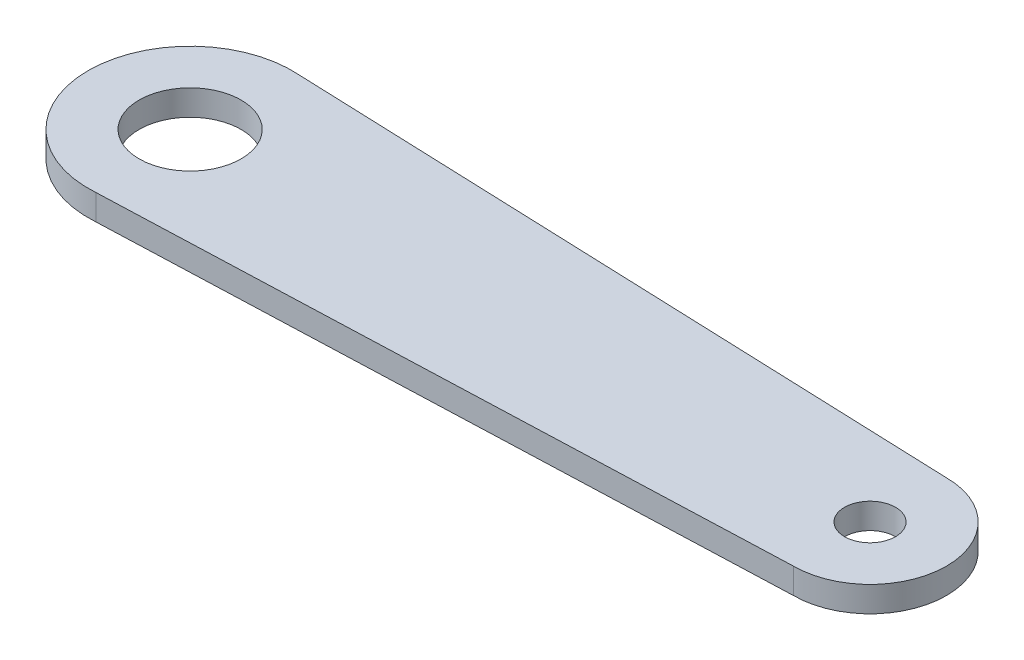
ISO-10303-21;
HEADER;
FILE_DESCRIPTION(('STEP AP214'),'2;1');
FILE_NAME('part.step','',(''),(''),'','','');
FILE_SCHEMA(('AUTOMOTIVE_DESIGN { 1 0 10303 214 1 1 1 1 }'));
ENDSEC;
DATA;
#1=APPLICATION_CONTEXT('core data for automotive mechanical design processes');
#2=APPLICATION_PROTOCOL_DEFINITION('international standard','automotive_design',2000,#1);
#3=PRODUCT_CONTEXT('',#1,'mechanical');
#4=PRODUCT('Part','Part','',(#3));
#5=PRODUCT_RELATED_PRODUCT_CATEGORY('part','',(#4));
#6=PRODUCT_DEFINITION_FORMATION('','',#4);
#7=PRODUCT_DEFINITION_CONTEXT('part definition',#1,'design');
#8=PRODUCT_DEFINITION('design','',#6,#7);
#9=PRODUCT_DEFINITION_SHAPE('','',#8);
#10=(LENGTH_UNIT() NAMED_UNIT(*) SI_UNIT(.MILLI.,.METRE.));
#11=(NAMED_UNIT(*) PLANE_ANGLE_UNIT() SI_UNIT($,.RADIAN.));
#12=(NAMED_UNIT(*) SI_UNIT($,.STERADIAN.) SOLID_ANGLE_UNIT());
#13=UNCERTAINTY_MEASURE_WITH_UNIT(LENGTH_MEASURE(1.E-05),#10,'distance_accuracy_value','');
#14=(GEOMETRIC_REPRESENTATION_CONTEXT(3) GLOBAL_UNCERTAINTY_ASSIGNED_CONTEXT((#13)) GLOBAL_UNIT_ASSIGNED_CONTEXT((#10,
#11,#12)) REPRESENTATION_CONTEXT('',''));
#15=CARTESIAN_POINT('',(0.,0.,0.));
#16=DIRECTION('',(0.,0.,1.));
#17=DIRECTION('',(1.,0.,0.));
#18=AXIS2_PLACEMENT_3D('',#15,#16,#17);
#19=CARTESIAN_POINT('',(0.,1.5,0.));
#20=DIRECTION('',(0.,-1.,0.));
#21=DIRECTION('',(0.,0.,-1.));
#22=AXIS2_PLACEMENT_3D('',#19,#20,#21);
#23=CYLINDRICAL_SURFACE('',#22,6.);
#24=CARTESIAN_POINT('',(0.,0.,0.));
#25=DIRECTION('',(0.,1.,0.));
#26=DIRECTION('',(0.,0.,1.));
#27=AXIS2_PLACEMENT_3D('',#24,#25,#26);
#28=CIRCLE('',#27,6.);
#29=CARTESIAN_POINT('',(0.449368076142934,0.,-5.98314869714464));
#30=VERTEX_POINT('',#29);
#31=CARTESIAN_POINT('',(0.449368076142934,0.,5.98314869714464));
#32=VERTEX_POINT('',#31);
#33=EDGE_CURVE('E102',#30,#32,#28,.T.);
#34=ORIENTED_EDGE('',*,*,#33,.T.);
#35=DIRECTION('',(0.,-1.,0.));
#36=VECTOR('',#35,1.);
#37=CARTESIAN_POINT('',(0.449368076142934,1.5,5.98314869714464));
#38=LINE('',#37,#36);
#39=CARTESIAN_POINT('',(0.449368076142934,1.5,5.98314869714464));
#40=VERTEX_POINT('',#39);
#41=EDGE_CURVE('E11',#40,#32,#38,.T.);
#42=ORIENTED_EDGE('',*,*,#41,.F.);
#43=CARTESIAN_POINT('',(0.,1.5,0.));
#44=DIRECTION('',(0.,1.,0.));
#45=DIRECTION('',(0.,0.,1.));
#46=AXIS2_PLACEMENT_3D('',#43,#44,#45);
#47=CIRCLE('',#46,6.);
#48=CARTESIAN_POINT('',(0.449368076142934,1.5,-5.98314869714464));
#49=VERTEX_POINT('',#48);
#50=EDGE_CURVE('E87',#49,#40,#47,.T.);
#51=ORIENTED_EDGE('',*,*,#50,.F.);
#52=DIRECTION('',(0.,-1.,0.));
#53=VECTOR('',#52,1.);
#54=CARTESIAN_POINT('',(0.449368076142934,1.5,-5.98314869714464));
#55=LINE('',#54,#53);
#56=EDGE_CURVE('E54',#49,#30,#55,.T.);
#57=ORIENTED_EDGE('',*,*,#56,.T.);
#58=EDGE_LOOP('',(#34,#42,#51,#57));
#59=FACE_BOUND('',#58,.T.);
#60=ADVANCED_FACE('F36',(#59),#23,.T.);
#61=CARTESIAN_POINT('',(0.449368076142934,1.5,5.98314869714464));
#62=DIRECTION('',(-0.0374736605890943,0.,-0.999297615709181));
#63=DIRECTION('',(-0.999297615709181,0.,0.0374736605890943));
#64=AXIS2_PLACEMENT_3D('',#61,#62,#63);
#65=PLANE('',#64);
#66=DIRECTION('',(0.999297615709181,0.,-0.0374736605890943));
#67=VECTOR('',#66,1.);
#68=CARTESIAN_POINT('',(0.449368076142934,0.,5.98314869714464));
#69=LINE('',#68,#67);
#70=CARTESIAN_POINT('',(40.,0.,4.5));
#71=VERTEX_POINT('',#70);
#72=EDGE_CURVE('E92',#32,#71,#69,.T.);
#73=ORIENTED_EDGE('',*,*,#72,.T.);
#74=DIRECTION('',(0.,-1.,0.));
#75=VECTOR('',#74,1.);
#76=CARTESIAN_POINT('',(40.,1.5,4.5));
#77=LINE('',#76,#75);
#78=CARTESIAN_POINT('',(40.,1.5,4.5));
#79=VERTEX_POINT('',#78);
#80=EDGE_CURVE('E45',#79,#71,#77,.T.);
#81=ORIENTED_EDGE('',*,*,#80,.F.);
#82=DIRECTION('',(0.999297615709181,0.,-0.0374736605890943));
#83=VECTOR('',#82,1.);
#84=CARTESIAN_POINT('',(0.449368076142934,1.5,5.98314869714464));
#85=LINE('',#84,#83);
#86=EDGE_CURVE('E80',#40,#79,#85,.T.);
#87=ORIENTED_EDGE('',*,*,#86,.F.);
#88=ORIENTED_EDGE('',*,*,#41,.T.);
#89=EDGE_LOOP('',(#73,#81,#87,#88));
#90=FACE_BOUND('',#89,.T.);
#91=ADVANCED_FACE('F91',(#90),#65,.F.);
#92=CARTESIAN_POINT('',(40.,1.5,0.));
#93=DIRECTION('',(0.,-1.,0.));
#94=DIRECTION('',(0.,0.,-1.));
#95=AXIS2_PLACEMENT_3D('',#92,#93,#94);
#96=CYLINDRICAL_SURFACE('',#95,4.5);
#97=CARTESIAN_POINT('',(40.,0.,0.));
#98=DIRECTION('',(0.,1.,0.));
#99=DIRECTION('',(0.,0.,1.));
#100=AXIS2_PLACEMENT_3D('',#97,#98,#99);
#101=CIRCLE('',#100,4.5);
#102=CARTESIAN_POINT('',(40.,0.,-4.5));
#103=VERTEX_POINT('',#102);
#104=EDGE_CURVE('E106',#71,#103,#101,.T.);
#105=ORIENTED_EDGE('',*,*,#104,.T.);
#106=DIRECTION('',(0.,-1.,0.));
#107=VECTOR('',#106,1.);
#108=CARTESIAN_POINT('',(40.,1.5,-4.5));
#109=LINE('',#108,#107);
#110=CARTESIAN_POINT('',(40.,1.5,-4.5));
#111=VERTEX_POINT('',#110);
#112=EDGE_CURVE('E69',#111,#103,#109,.T.);
#113=ORIENTED_EDGE('',*,*,#112,.F.);
#114=CARTESIAN_POINT('',(40.,1.5,0.));
#115=DIRECTION('',(0.,1.,0.));
#116=DIRECTION('',(0.,0.,1.));
#117=AXIS2_PLACEMENT_3D('',#114,#115,#116);
#118=CIRCLE('',#117,4.5);
#119=EDGE_CURVE('E86',#79,#111,#118,.T.);
#120=ORIENTED_EDGE('',*,*,#119,.F.);
#121=ORIENTED_EDGE('',*,*,#80,.T.);
#122=EDGE_LOOP('',(#105,#113,#120,#121));
#123=FACE_BOUND('',#122,.T.);
#124=ADVANCED_FACE('F96',(#123),#96,.T.);
#125=CARTESIAN_POINT('',(0.449368076142934,1.5,-5.98314869714464));
#126=DIRECTION('',(0.0374736605890943,0.,-0.999297615709181));
#127=DIRECTION('',(-0.999297615709181,0.,-0.0374736605890943));
#128=AXIS2_PLACEMENT_3D('',#125,#126,#127);
#129=PLANE('',#128);
#130=DIRECTION('',(0.999297615709181,0.,0.0374736605890943));
#131=VECTOR('',#130,1.);
#132=CARTESIAN_POINT('',(0.449368076142934,0.,-5.98314869714464));
#133=LINE('',#132,#131);
#134=EDGE_CURVE('E108',#30,#103,#133,.T.);
#135=ORIENTED_EDGE('',*,*,#134,.F.);
#136=ORIENTED_EDGE('',*,*,#56,.F.);
#137=DIRECTION('',(0.999297615709181,0.,0.0374736605890943));
#138=VECTOR('',#137,1.);
#139=CARTESIAN_POINT('',(0.449368076142934,1.5,-5.98314869714464));
#140=LINE('',#139,#138);
#141=EDGE_CURVE('E97',#49,#111,#140,.T.);
#142=ORIENTED_EDGE('',*,*,#141,.T.);
#143=ORIENTED_EDGE('',*,*,#112,.T.);
#144=EDGE_LOOP('',(#135,#136,#142,#143));
#145=FACE_BOUND('',#144,.T.);
#146=ADVANCED_FACE('F139',(#145),#129,.T.);
#147=CARTESIAN_POINT('',(0.,1.5,0.));
#148=DIRECTION('',(0.,1.,0.));
#149=DIRECTION('',(0.,0.,1.));
#150=AXIS2_PLACEMENT_3D('',#147,#148,#149);
#151=PLANE('',#150);
#152=CARTESIAN_POINT('',(0.,1.5,0.));
#153=DIRECTION('',(0.,1.,0.));
#154=DIRECTION('',(0.,0.,1.));
#155=AXIS2_PLACEMENT_3D('',#152,#153,#154);
#156=CIRCLE('',#155,3.);
#157=CARTESIAN_POINT('',(0.,1.5,3.));
#158=VERTEX_POINT('',#157);
#159=EDGE_CURVE('E104',#158,#158,#156,.F.);
#160=ORIENTED_EDGE('',*,*,#159,.T.);
#161=EDGE_LOOP('',(#160));
#162=FACE_BOUND('',#161,.T.);
#163=CARTESIAN_POINT('',(40.,1.5,0.));
#164=DIRECTION('',(0.,1.,0.));
#165=DIRECTION('',(0.,0.,1.));
#166=AXIS2_PLACEMENT_3D('',#163,#164,#165);
#167=CIRCLE('',#166,1.5);
#168=CARTESIAN_POINT('',(40.,1.5,1.5));
#169=VERTEX_POINT('',#168);
#170=EDGE_CURVE('E114',#169,#169,#167,.F.);
#171=ORIENTED_EDGE('',*,*,#170,.T.);
#172=EDGE_LOOP('',(#171));
#173=FACE_BOUND('',#172,.T.);
#174=ORIENTED_EDGE('',*,*,#50,.T.);
#175=ORIENTED_EDGE('',*,*,#86,.T.);
#176=ORIENTED_EDGE('',*,*,#119,.T.);
#177=ORIENTED_EDGE('',*,*,#141,.F.);
#178=EDGE_LOOP('',(#174,#175,#176,#177));
#179=FACE_BOUND('',#178,.T.);
#180=ADVANCED_FACE('F83',(#162,#173,#179),#151,.T.);
#181=CARTESIAN_POINT('',(0.,0.,0.));
#182=DIRECTION('',(0.,1.,0.));
#183=DIRECTION('',(0.,0.,1.));
#184=AXIS2_PLACEMENT_3D('',#181,#182,#183);
#185=PLANE('',#184);
#186=CARTESIAN_POINT('',(0.,0.,0.));
#187=DIRECTION('',(0.,1.,0.));
#188=DIRECTION('',(0.,0.,1.));
#189=AXIS2_PLACEMENT_3D('',#186,#187,#188);
#190=CIRCLE('',#189,3.);
#191=CARTESIAN_POINT('',(0.,0.,3.));
#192=VERTEX_POINT('',#191);
#193=EDGE_CURVE('E39',#192,#192,#190,.F.);
#194=ORIENTED_EDGE('',*,*,#193,.F.);
#195=EDGE_LOOP('',(#194));
#196=FACE_BOUND('',#195,.T.);
#197=CARTESIAN_POINT('',(40.,0.,0.));
#198=DIRECTION('',(0.,1.,0.));
#199=DIRECTION('',(0.,0.,1.));
#200=AXIS2_PLACEMENT_3D('',#197,#198,#199);
#201=CIRCLE('',#200,1.5);
#202=CARTESIAN_POINT('',(40.,0.,1.5));
#203=VERTEX_POINT('',#202);
#204=EDGE_CURVE('E112',#203,#203,#201,.F.);
#205=ORIENTED_EDGE('',*,*,#204,.F.);
#206=EDGE_LOOP('',(#205));
#207=FACE_BOUND('',#206,.T.);
#208=ORIENTED_EDGE('',*,*,#33,.F.);
#209=ORIENTED_EDGE('',*,*,#134,.T.);
#210=ORIENTED_EDGE('',*,*,#104,.F.);
#211=ORIENTED_EDGE('',*,*,#72,.F.);
#212=EDGE_LOOP('',(#208,#209,#210,#211));
#213=FACE_BOUND('',#212,.T.);
#214=ADVANCED_FACE('F134',(#196,#207,#213),#185,.F.);
#215=CARTESIAN_POINT('',(40.,17.5,0.));
#216=DIRECTION('',(0.,-1.,0.));
#217=DIRECTION('',(0.,0.,-1.));
#218=AXIS2_PLACEMENT_3D('',#215,#216,#217);
#219=CYLINDRICAL_SURFACE('',#218,1.5);
#220=ORIENTED_EDGE('',*,*,#170,.F.);
#221=EDGE_LOOP('',(#220));
#222=FACE_BOUND('',#221,.T.);
#223=ORIENTED_EDGE('',*,*,#204,.T.);
#224=EDGE_LOOP('',(#223));
#225=FACE_BOUND('',#224,.T.);
#226=ADVANCED_FACE('F130',(#222,#225),#219,.F.);
#227=CARTESIAN_POINT('',(0.,17.5,0.));
#228=DIRECTION('',(0.,-1.,0.));
#229=DIRECTION('',(0.,0.,-1.));
#230=AXIS2_PLACEMENT_3D('',#227,#228,#229);
#231=CYLINDRICAL_SURFACE('',#230,3.);
#232=ORIENTED_EDGE('',*,*,#159,.F.);
#233=EDGE_LOOP('',(#232));
#234=FACE_BOUND('',#233,.T.);
#235=ORIENTED_EDGE('',*,*,#193,.T.);
#236=EDGE_LOOP('',(#235));
#237=FACE_BOUND('',#236,.T.);
#238=ADVANCED_FACE('F127',(#234,#237),#231,.F.);
#239=CLOSED_SHELL('',(#60,#91,#124,#146,#180,#214,#226,#238));
#240=MANIFOLD_SOLID_BREP('B2',#239);
#241=ADVANCED_BREP_SHAPE_REPRESENTATION('',(#18,#240),#14);
#242=SHAPE_DEFINITION_REPRESENTATION(#9,#241);
ENDSEC;
END-ISO-10303-21;
